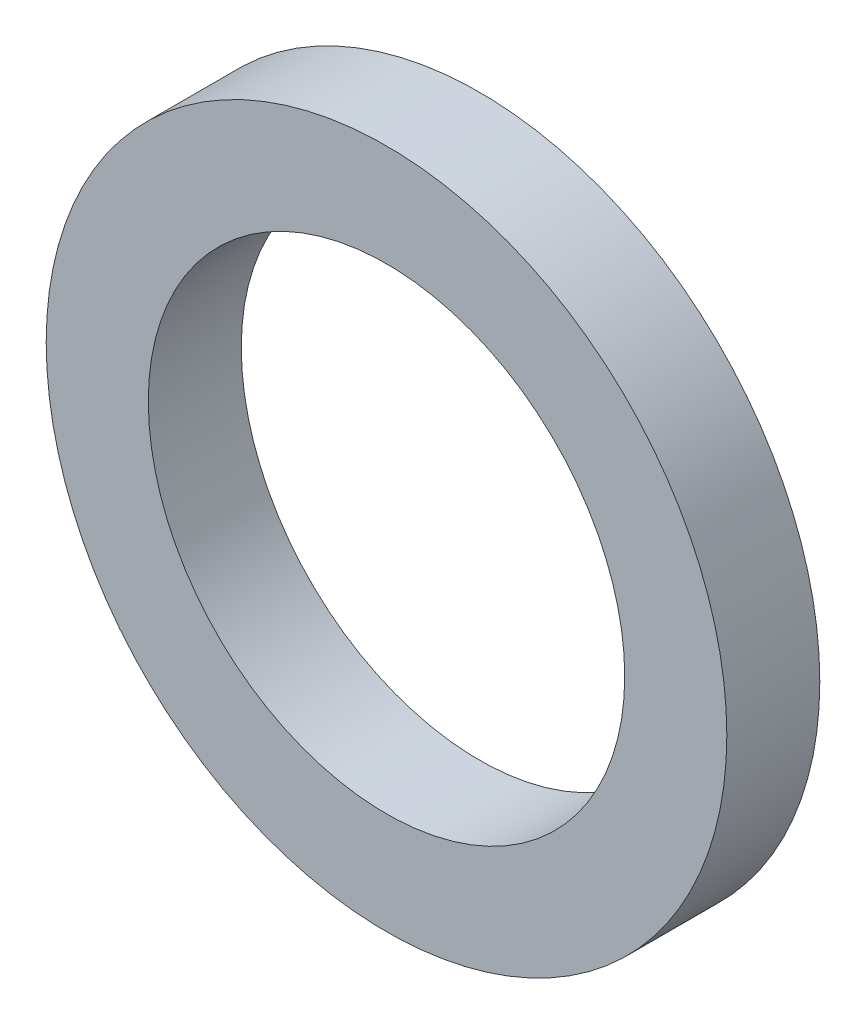
ISO-10303-21;
HEADER;
FILE_DESCRIPTION(('STEP AP214'),'2;1');
FILE_NAME('part.step','',(''),(''),'','','');
FILE_SCHEMA(('AUTOMOTIVE_DESIGN { 1 0 10303 214 1 1 1 1 }'));
ENDSEC;
DATA;
#1=APPLICATION_CONTEXT('core data for automotive mechanical design processes');
#2=APPLICATION_PROTOCOL_DEFINITION('international standard','automotive_design',2000,#1);
#3=PRODUCT_CONTEXT('',#1,'mechanical');
#4=PRODUCT('Part','Part','',(#3));
#5=PRODUCT_RELATED_PRODUCT_CATEGORY('part','',(#4));
#6=PRODUCT_DEFINITION_FORMATION('','',#4);
#7=PRODUCT_DEFINITION_CONTEXT('part definition',#1,'design');
#8=PRODUCT_DEFINITION('design','',#6,#7);
#9=PRODUCT_DEFINITION_SHAPE('','',#8);
#10=(LENGTH_UNIT() NAMED_UNIT(*) SI_UNIT(.MILLI.,.METRE.));
#11=(NAMED_UNIT(*) PLANE_ANGLE_UNIT() SI_UNIT($,.RADIAN.));
#12=(NAMED_UNIT(*) SI_UNIT($,.STERADIAN.) SOLID_ANGLE_UNIT());
#13=UNCERTAINTY_MEASURE_WITH_UNIT(LENGTH_MEASURE(1.E-05),#10,'distance_accuracy_value','');
#14=(GEOMETRIC_REPRESENTATION_CONTEXT(3) GLOBAL_UNCERTAINTY_ASSIGNED_CONTEXT((#13)) GLOBAL_UNIT_ASSIGNED_CONTEXT((#10,
#11,#12)) REPRESENTATION_CONTEXT('',''));
#15=CARTESIAN_POINT('',(0.,0.,0.));
#16=DIRECTION('',(0.,0.,1.));
#17=DIRECTION('',(1.,0.,0.));
#18=AXIS2_PLACEMENT_3D('',#15,#16,#17);
#19=CARTESIAN_POINT('',(0.,0.,6.83));
#20=DIRECTION('',(0.,0.,1.));
#21=DIRECTION('',(1.,0.,0.));
#22=AXIS2_PLACEMENT_3D('',#19,#20,#21);
#23=PLANE('',#22);
#24=CARTESIAN_POINT('',(0.,0.,6.83));
#25=DIRECTION('',(0.,0.,1.));
#26=DIRECTION('',(1.,0.,0.));
#27=AXIS2_PLACEMENT_3D('',#24,#25,#26);
#28=CIRCLE('',#27,25.);
#29=CARTESIAN_POINT('',(25.,0.,6.83));
#30=VERTEX_POINT('',#29);
#31=EDGE_CURVE('E10',#30,#30,#28,.T.);
#32=ORIENTED_EDGE('',*,*,#31,.T.);
#33=EDGE_LOOP('',(#32));
#34=FACE_BOUND('',#33,.T.);
#35=CARTESIAN_POINT('',(0.,0.,6.83));
#36=DIRECTION('',(0.,0.,1.));
#37=DIRECTION('',(1.,0.,0.));
#38=AXIS2_PLACEMENT_3D('',#35,#36,#37);
#39=CIRCLE('',#38,17.5);
#40=CARTESIAN_POINT('',(17.5,0.,6.83));
#41=VERTEX_POINT('',#40);
#42=EDGE_CURVE('E50',#41,#41,#39,.T.);
#43=ORIENTED_EDGE('',*,*,#42,.F.);
#44=EDGE_LOOP('',(#43));
#45=FACE_BOUND('',#44,.T.);
#46=ADVANCED_FACE('F37',(#34,#45),#23,.T.);
#47=CARTESIAN_POINT('',(0.,0.,0.));
#48=DIRECTION('',(0.,0.,1.));
#49=DIRECTION('',(1.,0.,0.));
#50=AXIS2_PLACEMENT_3D('',#47,#48,#49);
#51=PLANE('',#50);
#52=CARTESIAN_POINT('',(0.,0.,0.));
#53=DIRECTION('',(0.,0.,1.));
#54=DIRECTION('',(1.,0.,0.));
#55=AXIS2_PLACEMENT_3D('',#52,#53,#54);
#56=CIRCLE('',#55,25.);
#57=CARTESIAN_POINT('',(25.,0.,0.));
#58=VERTEX_POINT('',#57);
#59=EDGE_CURVE('E41',#58,#58,#56,.T.);
#60=ORIENTED_EDGE('',*,*,#59,.F.);
#61=EDGE_LOOP('',(#60));
#62=FACE_BOUND('',#61,.T.);
#63=CARTESIAN_POINT('',(0.,0.,0.));
#64=DIRECTION('',(0.,0.,1.));
#65=DIRECTION('',(1.,0.,0.));
#66=AXIS2_PLACEMENT_3D('',#63,#64,#65);
#67=CIRCLE('',#66,17.5);
#68=CARTESIAN_POINT('',(17.5,0.,0.));
#69=VERTEX_POINT('',#68);
#70=EDGE_CURVE('E52',#69,#69,#67,.T.);
#71=ORIENTED_EDGE('',*,*,#70,.T.);
#72=EDGE_LOOP('',(#71));
#73=FACE_BOUND('',#72,.T.);
#74=ADVANCED_FACE('F64',(#62,#73),#51,.F.);
#75=CARTESIAN_POINT('',(0.,0.,6.83));
#76=DIRECTION('',(0.,0.,-1.));
#77=DIRECTION('',(-1.,0.,0.));
#78=AXIS2_PLACEMENT_3D('',#75,#76,#77);
#79=CYLINDRICAL_SURFACE('',#78,25.);
#80=ORIENTED_EDGE('',*,*,#31,.F.);
#81=EDGE_LOOP('',(#80));
#82=FACE_BOUND('',#81,.T.);
#83=ORIENTED_EDGE('',*,*,#59,.T.);
#84=EDGE_LOOP('',(#83));
#85=FACE_BOUND('',#84,.T.);
#86=ADVANCED_FACE('F39',(#82,#85),#79,.T.);
#87=CARTESIAN_POINT('',(0.,0.,6.83));
#88=DIRECTION('',(0.,0.,-1.));
#89=DIRECTION('',(-1.,0.,0.));
#90=AXIS2_PLACEMENT_3D('',#87,#88,#89);
#91=CYLINDRICAL_SURFACE('',#90,17.5);
#92=ORIENTED_EDGE('',*,*,#42,.T.);
#93=EDGE_LOOP('',(#92));
#94=FACE_BOUND('',#93,.T.);
#95=ORIENTED_EDGE('',*,*,#70,.F.);
#96=EDGE_LOOP('',(#95));
#97=FACE_BOUND('',#96,.T.);
#98=ADVANCED_FACE('F60',(#94,#97),#91,.F.);
#99=CLOSED_SHELL('',(#46,#74,#86,#98));
#100=MANIFOLD_SOLID_BREP('B2',#99);
#101=ADVANCED_BREP_SHAPE_REPRESENTATION('',(#18,#100),#14);
#102=SHAPE_DEFINITION_REPRESENTATION(#9,#101);
ENDSEC;
END-ISO-10303-21;
